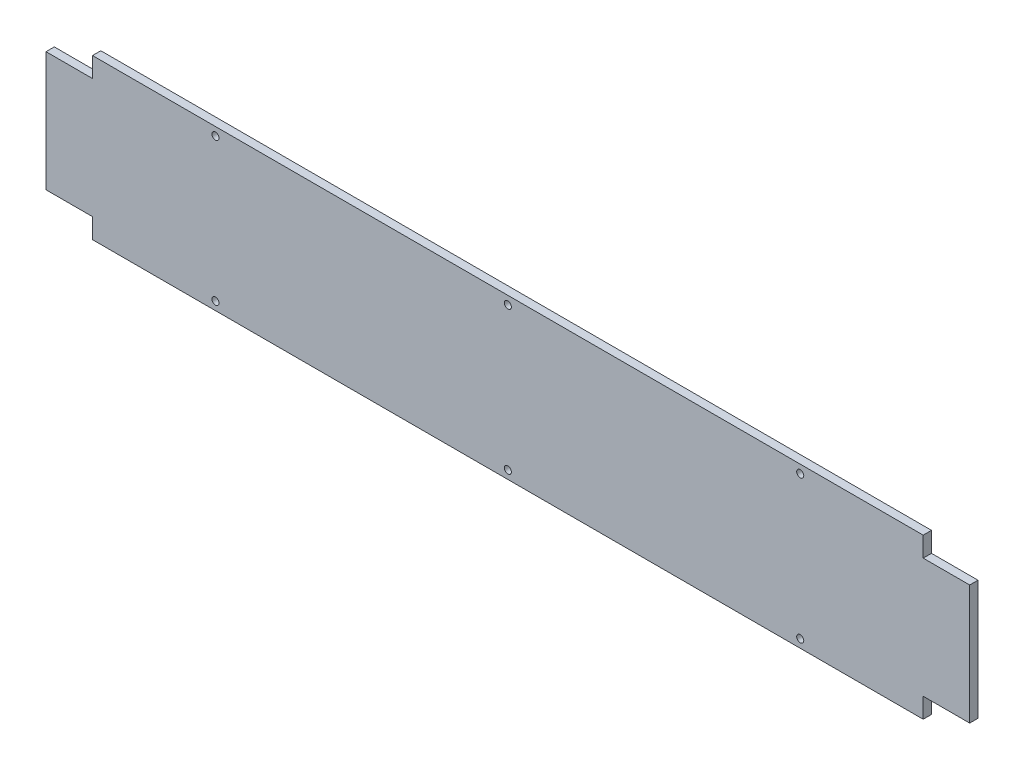
ISO-10303-21;
HEADER;
FILE_DESCRIPTION(('STEP AP214'),'2;1');
FILE_NAME('part.step','',(''),(''),'','','');
FILE_SCHEMA(('AUTOMOTIVE_DESIGN { 1 0 10303 214 1 1 1 1 }'));
ENDSEC;
DATA;
#1=APPLICATION_CONTEXT('core data for automotive mechanical design processes');
#2=APPLICATION_PROTOCOL_DEFINITION('international standard','automotive_design',2000,#1);
#3=PRODUCT_CONTEXT('',#1,'mechanical');
#4=PRODUCT('Part','Part','',(#3));
#5=PRODUCT_RELATED_PRODUCT_CATEGORY('part','',(#4));
#6=PRODUCT_DEFINITION_FORMATION('','',#4);
#7=PRODUCT_DEFINITION_CONTEXT('part definition',#1,'design');
#8=PRODUCT_DEFINITION('design','',#6,#7);
#9=PRODUCT_DEFINITION_SHAPE('','',#8);
#10=(LENGTH_UNIT() NAMED_UNIT(*) SI_UNIT(.MILLI.,.METRE.));
#11=(NAMED_UNIT(*) PLANE_ANGLE_UNIT() SI_UNIT($,.RADIAN.));
#12=(NAMED_UNIT(*) SI_UNIT($,.STERADIAN.) SOLID_ANGLE_UNIT());
#13=UNCERTAINTY_MEASURE_WITH_UNIT(LENGTH_MEASURE(1.E-05),#10,'distance_accuracy_value','');
#14=(GEOMETRIC_REPRESENTATION_CONTEXT(3) GLOBAL_UNCERTAINTY_ASSIGNED_CONTEXT((#13)) GLOBAL_UNIT_ASSIGNED_CONTEXT((#10,
#11,#12)) REPRESENTATION_CONTEXT('',''));
#15=CARTESIAN_POINT('',(0.,0.,0.));
#16=DIRECTION('',(0.,0.,1.));
#17=DIRECTION('',(1.,0.,0.));
#18=AXIS2_PLACEMENT_3D('',#15,#16,#17);
#19=CARTESIAN_POINT('',(0.,0.,5.));
#20=DIRECTION('',(1.,0.,0.));
#21=DIRECTION('',(0.,0.,-1.));
#22=AXIS2_PLACEMENT_3D('',#19,#20,#21);
#23=PLANE('',#22);
#24=DIRECTION('',(0.,0.,1.));
#25=VECTOR('',#24,1.);
#26=CARTESIAN_POINT('',(0.,12.,0.));
#27=LINE('',#26,#25);
#28=CARTESIAN_POINT('',(0.,12.,0.));
#29=VERTEX_POINT('',#28);
#30=CARTESIAN_POINT('',(0.,12.,5.));
#31=VERTEX_POINT('',#30);
#32=EDGE_CURVE('E132',#29,#31,#27,.T.);
#33=ORIENTED_EDGE('',*,*,#32,.F.);
#34=DIRECTION('',(0.,-1.,0.));
#35=VECTOR('',#34,1.);
#36=CARTESIAN_POINT('',(0.,0.,0.));
#37=LINE('',#36,#35);
#38=CARTESIAN_POINT('',(0.,0.,0.));
#39=VERTEX_POINT('',#38);
#40=EDGE_CURVE('E176',#29,#39,#37,.T.);
#41=ORIENTED_EDGE('',*,*,#40,.T.);
#42=DIRECTION('',(0.,0.,-1.));
#43=VECTOR('',#42,1.);
#44=CARTESIAN_POINT('',(0.,0.,5.));
#45=LINE('',#44,#43);
#46=CARTESIAN_POINT('',(0.,0.,5.));
#47=VERTEX_POINT('',#46);
#48=EDGE_CURVE('E11',#47,#39,#45,.T.);
#49=ORIENTED_EDGE('',*,*,#48,.F.);
#50=DIRECTION('',(0.,-1.,0.));
#51=VECTOR('',#50,1.);
#52=CARTESIAN_POINT('',(0.,0.,5.));
#53=LINE('',#52,#51);
#54=EDGE_CURVE('E147',#31,#47,#53,.T.);
#55=ORIENTED_EDGE('',*,*,#54,.F.);
#56=EDGE_LOOP('',(#33,#41,#49,#55));
#57=FACE_BOUND('',#56,.T.);
#58=ADVANCED_FACE('F43',(#57),#23,.F.);
#59=CARTESIAN_POINT('',(500.,0.,5.));
#60=DIRECTION('',(-1.,0.,0.));
#61=DIRECTION('',(0.,0.,1.));
#62=AXIS2_PLACEMENT_3D('',#59,#60,#61);
#63=PLANE('',#62);
#64=DIRECTION('',(0.,0.,1.));
#65=VECTOR('',#64,1.);
#66=CARTESIAN_POINT('',(500.,84.,0.));
#67=LINE('',#66,#65);
#68=CARTESIAN_POINT('',(500.,84.,0.));
#69=VERTEX_POINT('',#68);
#70=CARTESIAN_POINT('',(500.,84.,5.));
#71=VERTEX_POINT('',#70);
#72=EDGE_CURVE('E218',#69,#71,#67,.T.);
#73=ORIENTED_EDGE('',*,*,#72,.F.);
#74=DIRECTION('',(0.,1.,0.));
#75=VECTOR('',#74,1.);
#76=CARTESIAN_POINT('',(500.,0.,0.));
#77=LINE('',#76,#75);
#78=CARTESIAN_POINT('',(500.,96.,0.));
#79=VERTEX_POINT('',#78);
#80=EDGE_CURVE('E178',#69,#79,#77,.T.);
#81=ORIENTED_EDGE('',*,*,#80,.T.);
#82=DIRECTION('',(0.,0.,-1.));
#83=VECTOR('',#82,1.);
#84=CARTESIAN_POINT('',(500.,96.,5.));
#85=LINE('',#84,#83);
#86=CARTESIAN_POINT('',(500.,96.,5.));
#87=VERTEX_POINT('',#86);
#88=EDGE_CURVE('E183',#87,#79,#85,.T.);
#89=ORIENTED_EDGE('',*,*,#88,.F.);
#90=DIRECTION('',(0.,1.,0.));
#91=VECTOR('',#90,1.);
#92=CARTESIAN_POINT('',(500.,0.,5.));
#93=LINE('',#92,#91);
#94=EDGE_CURVE('E165',#71,#87,#93,.T.);
#95=ORIENTED_EDGE('',*,*,#94,.F.);
#96=EDGE_LOOP('',(#73,#81,#89,#95));
#97=FACE_BOUND('',#96,.T.);
#98=ADVANCED_FACE('F280',(#97),#63,.F.);
#99=CARTESIAN_POINT('',(0.,96.,0.));
#100=VERTEX_POINT('',#99);
#101=CARTESIAN_POINT('',(0.,84.,0.));
#102=VERTEX_POINT('',#101);
#103=EDGE_CURVE('E172',#100,#102,#37,.T.);
#104=ORIENTED_EDGE('',*,*,#103,.T.);
#105=DIRECTION('',(0.,0.,1.));
#106=VECTOR('',#105,1.);
#107=CARTESIAN_POINT('',(0.,84.,0.));
#108=LINE('',#107,#106);
#109=CARTESIAN_POINT('',(0.,84.,5.));
#110=VERTEX_POINT('',#109);
#111=EDGE_CURVE('E294',#102,#110,#108,.T.);
#112=ORIENTED_EDGE('',*,*,#111,.T.);
#113=CARTESIAN_POINT('',(0.,96.,5.));
#114=VERTEX_POINT('',#113);
#115=EDGE_CURVE('E154',#114,#110,#53,.T.);
#116=ORIENTED_EDGE('',*,*,#115,.F.);
#117=DIRECTION('',(0.,0.,-1.));
#118=VECTOR('',#117,1.);
#119=CARTESIAN_POINT('',(0.,96.,5.));
#120=LINE('',#119,#118);
#121=EDGE_CURVE('E171',#114,#100,#120,.T.);
#122=ORIENTED_EDGE('',*,*,#121,.T.);
#123=EDGE_LOOP('',(#104,#112,#116,#122));
#124=FACE_BOUND('',#123,.T.);
#125=ADVANCED_FACE('F45',(#124),#23,.F.);
#126=CARTESIAN_POINT('',(0.,0.,5.));
#127=DIRECTION('',(0.,1.,0.));
#128=DIRECTION('',(0.,0.,1.));
#129=AXIS2_PLACEMENT_3D('',#126,#127,#128);
#130=PLANE('',#129);
#131=DIRECTION('',(1.,0.,0.));
#132=VECTOR('',#131,1.);
#133=CARTESIAN_POINT('',(0.,0.,0.));
#134=LINE('',#133,#132);
#135=CARTESIAN_POINT('',(500.,0.,0.));
#136=VERTEX_POINT('',#135);
#137=EDGE_CURVE('E175',#39,#136,#134,.T.);
#138=ORIENTED_EDGE('',*,*,#137,.T.);
#139=DIRECTION('',(0.,0.,-1.));
#140=VECTOR('',#139,1.);
#141=CARTESIAN_POINT('',(500.,0.,5.));
#142=LINE('',#141,#140);
#143=CARTESIAN_POINT('',(500.,0.,5.));
#144=VERTEX_POINT('',#143);
#145=EDGE_CURVE('E51',#144,#136,#142,.T.);
#146=ORIENTED_EDGE('',*,*,#145,.F.);
#147=DIRECTION('',(1.,0.,0.));
#148=VECTOR('',#147,1.);
#149=CARTESIAN_POINT('',(0.,0.,5.));
#150=LINE('',#149,#148);
#151=EDGE_CURVE('E157',#47,#144,#150,.T.);
#152=ORIENTED_EDGE('',*,*,#151,.F.);
#153=ORIENTED_EDGE('',*,*,#48,.T.);
#154=EDGE_LOOP('',(#138,#146,#152,#153));
#155=FACE_BOUND('',#154,.T.);
#156=ADVANCED_FACE('F288',(#155),#130,.F.);
#157=CARTESIAN_POINT('',(500.,12.,0.));
#158=VERTEX_POINT('',#157);
#159=EDGE_CURVE('E158',#136,#158,#77,.T.);
#160=ORIENTED_EDGE('',*,*,#159,.T.);
#161=DIRECTION('',(0.,0.,1.));
#162=VECTOR('',#161,1.);
#163=CARTESIAN_POINT('',(500.,12.,0.));
#164=LINE('',#163,#162);
#165=CARTESIAN_POINT('',(500.,12.,5.));
#166=VERTEX_POINT('',#165);
#167=EDGE_CURVE('E214',#158,#166,#164,.T.);
#168=ORIENTED_EDGE('',*,*,#167,.T.);
#169=EDGE_CURVE('E166',#144,#166,#93,.T.);
#170=ORIENTED_EDGE('',*,*,#169,.F.);
#171=ORIENTED_EDGE('',*,*,#145,.T.);
#172=EDGE_LOOP('',(#160,#168,#170,#171));
#173=FACE_BOUND('',#172,.T.);
#174=ADVANCED_FACE('F190',(#173),#63,.F.);
#175=CARTESIAN_POINT('',(0.,96.,5.));
#176=DIRECTION('',(0.,-1.,0.));
#177=DIRECTION('',(0.,0.,-1.));
#178=AXIS2_PLACEMENT_3D('',#175,#176,#177);
#179=PLANE('',#178);
#180=DIRECTION('',(-1.,0.,0.));
#181=VECTOR('',#180,1.);
#182=CARTESIAN_POINT('',(0.,96.,0.));
#183=LINE('',#182,#181);
#184=EDGE_CURVE('E155',#79,#100,#183,.T.);
#185=ORIENTED_EDGE('',*,*,#184,.T.);
#186=ORIENTED_EDGE('',*,*,#121,.F.);
#187=DIRECTION('',(-1.,0.,0.));
#188=VECTOR('',#187,1.);
#189=CARTESIAN_POINT('',(0.,96.,5.));
#190=LINE('',#189,#188);
#191=EDGE_CURVE('E169',#87,#114,#190,.T.);
#192=ORIENTED_EDGE('',*,*,#191,.F.);
#193=ORIENTED_EDGE('',*,*,#88,.T.);
#194=EDGE_LOOP('',(#185,#186,#192,#193));
#195=FACE_BOUND('',#194,.T.);
#196=ADVANCED_FACE('F264',(#195),#179,.F.);
#197=CARTESIAN_POINT('',(0.,0.,5.));
#198=DIRECTION('',(0.,0.,-1.));
#199=DIRECTION('',(-1.,0.,0.));
#200=AXIS2_PLACEMENT_3D('',#197,#198,#199);
#201=PLANE('',#200);
#202=CARTESIAN_POINT('',(74.,5.,5.));
#203=DIRECTION('',(0.,0.,1.));
#204=DIRECTION('',(-1.,0.,0.));
#205=AXIS2_PLACEMENT_3D('',#202,#203,#204);
#206=CIRCLE('',#205,2.125);
#207=CARTESIAN_POINT('',(71.875,5.,5.));
#208=VERTEX_POINT('',#207);
#209=EDGE_CURVE('E250',#208,#208,#206,.T.);
#210=ORIENTED_EDGE('',*,*,#209,.F.);
#211=EDGE_LOOP('',(#210));
#212=FACE_BOUND('',#211,.T.);
#213=CARTESIAN_POINT('',(250.,5.,5.));
#214=DIRECTION('',(0.,0.,1.));
#215=DIRECTION('',(-1.,0.,0.));
#216=AXIS2_PLACEMENT_3D('',#213,#214,#215);
#217=CIRCLE('',#216,2.125);
#218=CARTESIAN_POINT('',(247.875,5.,5.));
#219=VERTEX_POINT('',#218);
#220=EDGE_CURVE('E244',#219,#219,#217,.T.);
#221=ORIENTED_EDGE('',*,*,#220,.F.);
#222=EDGE_LOOP('',(#221));
#223=FACE_BOUND('',#222,.T.);
#224=CARTESIAN_POINT('',(426.,5.,5.));
#225=DIRECTION('',(0.,0.,1.));
#226=DIRECTION('',(-1.,0.,0.));
#227=AXIS2_PLACEMENT_3D('',#224,#225,#226);
#228=CIRCLE('',#227,2.125);
#229=CARTESIAN_POINT('',(423.875,5.,5.));
#230=VERTEX_POINT('',#229);
#231=EDGE_CURVE('E238',#230,#230,#228,.T.);
#232=ORIENTED_EDGE('',*,*,#231,.F.);
#233=EDGE_LOOP('',(#232));
#234=FACE_BOUND('',#233,.T.);
#235=CARTESIAN_POINT('',(426.,91.,5.));
#236=DIRECTION('',(0.,0.,1.));
#237=DIRECTION('',(1.,0.,0.));
#238=AXIS2_PLACEMENT_3D('',#235,#236,#237);
#239=CIRCLE('',#238,2.125);
#240=CARTESIAN_POINT('',(428.125,91.,5.));
#241=VERTEX_POINT('',#240);
#242=EDGE_CURVE('E232',#241,#241,#239,.T.);
#243=ORIENTED_EDGE('',*,*,#242,.F.);
#244=EDGE_LOOP('',(#243));
#245=FACE_BOUND('',#244,.T.);
#246=CARTESIAN_POINT('',(250.,91.,5.));
#247=DIRECTION('',(0.,0.,1.));
#248=DIRECTION('',(1.,0.,0.));
#249=AXIS2_PLACEMENT_3D('',#246,#247,#248);
#250=CIRCLE('',#249,2.125);
#251=CARTESIAN_POINT('',(252.125,91.,5.));
#252=VERTEX_POINT('',#251);
#253=EDGE_CURVE('E226',#252,#252,#250,.T.);
#254=ORIENTED_EDGE('',*,*,#253,.F.);
#255=EDGE_LOOP('',(#254));
#256=FACE_BOUND('',#255,.T.);
#257=CARTESIAN_POINT('',(74.,91.,5.));
#258=DIRECTION('',(0.,0.,1.));
#259=DIRECTION('',(1.,0.,0.));
#260=AXIS2_PLACEMENT_3D('',#257,#258,#259);
#261=CIRCLE('',#260,2.125);
#262=CARTESIAN_POINT('',(76.125,91.,5.));
#263=VERTEX_POINT('',#262);
#264=EDGE_CURVE('E162',#263,#263,#261,.T.);
#265=ORIENTED_EDGE('',*,*,#264,.F.);
#266=EDGE_LOOP('',(#265));
#267=FACE_BOUND('',#266,.T.);
#268=ORIENTED_EDGE('',*,*,#115,.T.);
#269=DIRECTION('',(-1.,0.,0.));
#270=VECTOR('',#269,1.);
#271=CARTESIAN_POINT('',(0.,84.,5.));
#272=LINE('',#271,#270);
#273=CARTESIAN_POINT('',(-28.,84.,5.));
#274=VERTEX_POINT('',#273);
#275=EDGE_CURVE('E58',#110,#274,#272,.T.);
#276=ORIENTED_EDGE('',*,*,#275,.T.);
#277=DIRECTION('',(0.,-1.,0.));
#278=VECTOR('',#277,1.);
#279=CARTESIAN_POINT('',(-28.,84.,5.));
#280=LINE('',#279,#278);
#281=CARTESIAN_POINT('',(-28.,12.,5.));
#282=VERTEX_POINT('',#281);
#283=EDGE_CURVE('E150',#274,#282,#280,.T.);
#284=ORIENTED_EDGE('',*,*,#283,.T.);
#285=DIRECTION('',(1.,0.,0.));
#286=VECTOR('',#285,1.);
#287=CARTESIAN_POINT('',(0.,12.,5.));
#288=LINE('',#287,#286);
#289=EDGE_CURVE('E135',#282,#31,#288,.T.);
#290=ORIENTED_EDGE('',*,*,#289,.T.);
#291=ORIENTED_EDGE('',*,*,#54,.T.);
#292=ORIENTED_EDGE('',*,*,#151,.T.);
#293=ORIENTED_EDGE('',*,*,#169,.T.);
#294=DIRECTION('',(1.,0.,0.));
#295=VECTOR('',#294,1.);
#296=CARTESIAN_POINT('',(500.,12.,5.));
#297=LINE('',#296,#295);
#298=CARTESIAN_POINT('',(528.,12.,5.));
#299=VERTEX_POINT('',#298);
#300=EDGE_CURVE('E66',#166,#299,#297,.T.);
#301=ORIENTED_EDGE('',*,*,#300,.T.);
#302=DIRECTION('',(0.,1.,0.));
#303=VECTOR('',#302,1.);
#304=CARTESIAN_POINT('',(528.,84.,5.));
#305=LINE('',#304,#303);
#306=CARTESIAN_POINT('',(528.,84.,5.));
#307=VERTEX_POINT('',#306);
#308=EDGE_CURVE('E208',#299,#307,#305,.T.);
#309=ORIENTED_EDGE('',*,*,#308,.T.);
#310=DIRECTION('',(-1.,0.,0.));
#311=VECTOR('',#310,1.);
#312=CARTESIAN_POINT('',(500.,84.,5.));
#313=LINE('',#312,#311);
#314=EDGE_CURVE('E203',#307,#71,#313,.T.);
#315=ORIENTED_EDGE('',*,*,#314,.T.);
#316=ORIENTED_EDGE('',*,*,#94,.T.);
#317=ORIENTED_EDGE('',*,*,#191,.T.);
#318=EDGE_LOOP('',(#268,#276,#284,#290,#291,#292,#293,#301,#309,#315,#316,#317));
#319=FACE_BOUND('',#318,.T.);
#320=ADVANCED_FACE('F146',(#212,#223,#234,#245,#256,#267,#319),#201,.F.);
#321=CARTESIAN_POINT('',(0.,0.,0.));
#322=DIRECTION('',(0.,0.,-1.));
#323=DIRECTION('',(-1.,0.,0.));
#324=AXIS2_PLACEMENT_3D('',#321,#322,#323);
#325=PLANE('',#324);
#326=CARTESIAN_POINT('',(74.,5.,0.));
#327=DIRECTION('',(0.,0.,1.));
#328=DIRECTION('',(-1.,0.,0.));
#329=AXIS2_PLACEMENT_3D('',#326,#327,#328);
#330=CIRCLE('',#329,2.125);
#331=CARTESIAN_POINT('',(71.875,5.,0.));
#332=VERTEX_POINT('',#331);
#333=EDGE_CURVE('E220',#332,#332,#330,.T.);
#334=ORIENTED_EDGE('',*,*,#333,.T.);
#335=EDGE_LOOP('',(#334));
#336=FACE_BOUND('',#335,.T.);
#337=CARTESIAN_POINT('',(250.,5.,0.));
#338=DIRECTION('',(0.,0.,1.));
#339=DIRECTION('',(-1.,0.,0.));
#340=AXIS2_PLACEMENT_3D('',#337,#338,#339);
#341=CIRCLE('',#340,2.125);
#342=CARTESIAN_POINT('',(247.875,5.,0.));
#343=VERTEX_POINT('',#342);
#344=EDGE_CURVE('E247',#343,#343,#341,.T.);
#345=ORIENTED_EDGE('',*,*,#344,.T.);
#346=EDGE_LOOP('',(#345));
#347=FACE_BOUND('',#346,.T.);
#348=CARTESIAN_POINT('',(426.,5.,0.));
#349=DIRECTION('',(0.,0.,1.));
#350=DIRECTION('',(-1.,0.,0.));
#351=AXIS2_PLACEMENT_3D('',#348,#349,#350);
#352=CIRCLE('',#351,2.125);
#353=CARTESIAN_POINT('',(423.875,5.,0.));
#354=VERTEX_POINT('',#353);
#355=EDGE_CURVE('E241',#354,#354,#352,.T.);
#356=ORIENTED_EDGE('',*,*,#355,.T.);
#357=EDGE_LOOP('',(#356));
#358=FACE_BOUND('',#357,.T.);
#359=CARTESIAN_POINT('',(426.,91.,0.));
#360=DIRECTION('',(0.,0.,1.));
#361=DIRECTION('',(1.,0.,0.));
#362=AXIS2_PLACEMENT_3D('',#359,#360,#361);
#363=CIRCLE('',#362,2.125);
#364=CARTESIAN_POINT('',(428.125,91.,0.));
#365=VERTEX_POINT('',#364);
#366=EDGE_CURVE('E235',#365,#365,#363,.T.);
#367=ORIENTED_EDGE('',*,*,#366,.T.);
#368=EDGE_LOOP('',(#367));
#369=FACE_BOUND('',#368,.T.);
#370=CARTESIAN_POINT('',(250.,91.,0.));
#371=DIRECTION('',(0.,0.,1.));
#372=DIRECTION('',(1.,0.,0.));
#373=AXIS2_PLACEMENT_3D('',#370,#371,#372);
#374=CIRCLE('',#373,2.125);
#375=CARTESIAN_POINT('',(252.125,91.,0.));
#376=VERTEX_POINT('',#375);
#377=EDGE_CURVE('E229',#376,#376,#374,.T.);
#378=ORIENTED_EDGE('',*,*,#377,.T.);
#379=EDGE_LOOP('',(#378));
#380=FACE_BOUND('',#379,.T.);
#381=CARTESIAN_POINT('',(74.,91.,0.));
#382=DIRECTION('',(0.,0.,1.));
#383=DIRECTION('',(1.,0.,0.));
#384=AXIS2_PLACEMENT_3D('',#381,#382,#383);
#385=CIRCLE('',#384,2.125);
#386=CARTESIAN_POINT('',(76.125,91.,0.));
#387=VERTEX_POINT('',#386);
#388=EDGE_CURVE('E254',#387,#387,#385,.T.);
#389=ORIENTED_EDGE('',*,*,#388,.T.);
#390=EDGE_LOOP('',(#389));
#391=FACE_BOUND('',#390,.T.);
#392=ORIENTED_EDGE('',*,*,#103,.F.);
#393=ORIENTED_EDGE('',*,*,#184,.F.);
#394=ORIENTED_EDGE('',*,*,#80,.F.);
#395=DIRECTION('',(-1.,0.,0.));
#396=VECTOR('',#395,1.);
#397=CARTESIAN_POINT('',(500.,84.,0.));
#398=LINE('',#397,#396);
#399=CARTESIAN_POINT('',(528.,84.,0.));
#400=VERTEX_POINT('',#399);
#401=EDGE_CURVE('E205',#400,#69,#398,.T.);
#402=ORIENTED_EDGE('',*,*,#401,.F.);
#403=DIRECTION('',(0.,1.,0.));
#404=VECTOR('',#403,1.);
#405=CARTESIAN_POINT('',(528.,84.,0.));
#406=LINE('',#405,#404);
#407=CARTESIAN_POINT('',(528.,12.,0.));
#408=VERTEX_POINT('',#407);
#409=EDGE_CURVE('E202',#408,#400,#406,.T.);
#410=ORIENTED_EDGE('',*,*,#409,.F.);
#411=DIRECTION('',(1.,0.,0.));
#412=VECTOR('',#411,1.);
#413=CARTESIAN_POINT('',(500.,12.,0.));
#414=LINE('',#413,#412);
#415=EDGE_CURVE('E199',#158,#408,#414,.T.);
#416=ORIENTED_EDGE('',*,*,#415,.F.);
#417=ORIENTED_EDGE('',*,*,#159,.F.);
#418=ORIENTED_EDGE('',*,*,#137,.F.);
#419=ORIENTED_EDGE('',*,*,#40,.F.);
#420=DIRECTION('',(1.,0.,0.));
#421=VECTOR('',#420,1.);
#422=CARTESIAN_POINT('',(0.,12.,0.));
#423=LINE('',#422,#421);
#424=CARTESIAN_POINT('',(-28.,12.,0.));
#425=VERTEX_POINT('',#424);
#426=EDGE_CURVE('E137',#425,#29,#423,.T.);
#427=ORIENTED_EDGE('',*,*,#426,.F.);
#428=DIRECTION('',(0.,-1.,0.));
#429=VECTOR('',#428,1.);
#430=CARTESIAN_POINT('',(-28.,84.,0.));
#431=LINE('',#430,#429);
#432=CARTESIAN_POINT('',(-28.,84.,0.));
#433=VERTEX_POINT('',#432);
#434=EDGE_CURVE('E302',#433,#425,#431,.T.);
#435=ORIENTED_EDGE('',*,*,#434,.F.);
#436=DIRECTION('',(-1.,0.,0.));
#437=VECTOR('',#436,1.);
#438=CARTESIAN_POINT('',(0.,84.,0.));
#439=LINE('',#438,#437);
#440=EDGE_CURVE('E151',#102,#433,#439,.T.);
#441=ORIENTED_EDGE('',*,*,#440,.F.);
#442=EDGE_LOOP('',(#392,#393,#394,#402,#410,#416,#417,#418,#419,#427,#435,#441));
#443=FACE_BOUND('',#442,.T.);
#444=ADVANCED_FACE('F196',(#336,#347,#358,#369,#380,#391,#443),#325,.T.);
#445=CARTESIAN_POINT('',(74.,91.,0.));
#446=DIRECTION('',(0.,0.,1.));
#447=DIRECTION('',(1.,0.,0.));
#448=AXIS2_PLACEMENT_3D('',#445,#446,#447);
#449=CYLINDRICAL_SURFACE('',#448,2.125);
#450=ORIENTED_EDGE('',*,*,#388,.F.);
#451=EDGE_LOOP('',(#450));
#452=FACE_BOUND('',#451,.T.);
#453=ORIENTED_EDGE('',*,*,#264,.T.);
#454=EDGE_LOOP('',(#453));
#455=FACE_BOUND('',#454,.T.);
#456=ADVANCED_FACE('F261',(#452,#455),#449,.F.);
#457=CARTESIAN_POINT('',(250.,91.,0.));
#458=DIRECTION('',(0.,0.,1.));
#459=DIRECTION('',(1.,0.,0.));
#460=AXIS2_PLACEMENT_3D('',#457,#458,#459);
#461=CYLINDRICAL_SURFACE('',#460,2.125);
#462=ORIENTED_EDGE('',*,*,#377,.F.);
#463=EDGE_LOOP('',(#462));
#464=FACE_BOUND('',#463,.T.);
#465=ORIENTED_EDGE('',*,*,#253,.T.);
#466=EDGE_LOOP('',(#465));
#467=FACE_BOUND('',#466,.T.);
#468=ADVANCED_FACE('F334',(#464,#467),#461,.F.);
#469=CARTESIAN_POINT('',(426.,91.,0.));
#470=DIRECTION('',(0.,0.,1.));
#471=DIRECTION('',(1.,0.,0.));
#472=AXIS2_PLACEMENT_3D('',#469,#470,#471);
#473=CYLINDRICAL_SURFACE('',#472,2.125);
#474=ORIENTED_EDGE('',*,*,#366,.F.);
#475=EDGE_LOOP('',(#474));
#476=FACE_BOUND('',#475,.T.);
#477=ORIENTED_EDGE('',*,*,#242,.T.);
#478=EDGE_LOOP('',(#477));
#479=FACE_BOUND('',#478,.T.);
#480=ADVANCED_FACE('F337',(#476,#479),#473,.F.);
#481=CARTESIAN_POINT('',(426.,5.,0.));
#482=DIRECTION('',(0.,0.,1.));
#483=DIRECTION('',(1.,0.,0.));
#484=AXIS2_PLACEMENT_3D('',#481,#482,#483);
#485=CYLINDRICAL_SURFACE('',#484,2.125);
#486=ORIENTED_EDGE('',*,*,#355,.F.);
#487=EDGE_LOOP('',(#486));
#488=FACE_BOUND('',#487,.T.);
#489=ORIENTED_EDGE('',*,*,#231,.T.);
#490=EDGE_LOOP('',(#489));
#491=FACE_BOUND('',#490,.T.);
#492=ADVANCED_FACE('F341',(#488,#491),#485,.F.);
#493=CARTESIAN_POINT('',(250.,5.,0.));
#494=DIRECTION('',(0.,0.,1.));
#495=DIRECTION('',(1.,0.,0.));
#496=AXIS2_PLACEMENT_3D('',#493,#494,#495);
#497=CYLINDRICAL_SURFACE('',#496,2.125);
#498=ORIENTED_EDGE('',*,*,#344,.F.);
#499=EDGE_LOOP('',(#498));
#500=FACE_BOUND('',#499,.T.);
#501=ORIENTED_EDGE('',*,*,#220,.T.);
#502=EDGE_LOOP('',(#501));
#503=FACE_BOUND('',#502,.T.);
#504=ADVANCED_FACE('F345',(#500,#503),#497,.F.);
#505=CARTESIAN_POINT('',(74.,5.,0.));
#506=DIRECTION('',(0.,0.,1.));
#507=DIRECTION('',(1.,0.,0.));
#508=AXIS2_PLACEMENT_3D('',#505,#506,#507);
#509=CYLINDRICAL_SURFACE('',#508,2.125);
#510=ORIENTED_EDGE('',*,*,#333,.F.);
#511=EDGE_LOOP('',(#510));
#512=FACE_BOUND('',#511,.T.);
#513=ORIENTED_EDGE('',*,*,#209,.T.);
#514=EDGE_LOOP('',(#513));
#515=FACE_BOUND('',#514,.T.);
#516=ADVANCED_FACE('F349',(#512,#515),#509,.F.);
#517=CARTESIAN_POINT('',(500.,84.,0.));
#518=DIRECTION('',(0.,1.,0.));
#519=DIRECTION('',(0.,0.,1.));
#520=AXIS2_PLACEMENT_3D('',#517,#518,#519);
#521=PLANE('',#520);
#522=ORIENTED_EDGE('',*,*,#314,.F.);
#523=DIRECTION('',(0.,0.,1.));
#524=VECTOR('',#523,1.);
#525=CARTESIAN_POINT('',(528.,84.,0.));
#526=LINE('',#525,#524);
#527=EDGE_CURVE('E221',#400,#307,#526,.T.);
#528=ORIENTED_EDGE('',*,*,#527,.F.);
#529=ORIENTED_EDGE('',*,*,#401,.T.);
#530=ORIENTED_EDGE('',*,*,#72,.T.);
#531=EDGE_LOOP('',(#522,#528,#529,#530));
#532=FACE_BOUND('',#531,.T.);
#533=ADVANCED_FACE('F319',(#532),#521,.T.);
#534=CARTESIAN_POINT('',(528.,84.,0.));
#535=DIRECTION('',(1.,0.,0.));
#536=DIRECTION('',(0.,0.,-1.));
#537=AXIS2_PLACEMENT_3D('',#534,#535,#536);
#538=PLANE('',#537);
#539=ORIENTED_EDGE('',*,*,#308,.F.);
#540=DIRECTION('',(0.,0.,1.));
#541=VECTOR('',#540,1.);
#542=CARTESIAN_POINT('',(528.,12.,0.));
#543=LINE('',#542,#541);
#544=EDGE_CURVE('E223',#408,#299,#543,.T.);
#545=ORIENTED_EDGE('',*,*,#544,.F.);
#546=ORIENTED_EDGE('',*,*,#409,.T.);
#547=ORIENTED_EDGE('',*,*,#527,.T.);
#548=EDGE_LOOP('',(#539,#545,#546,#547));
#549=FACE_BOUND('',#548,.T.);
#550=ADVANCED_FACE('F322',(#549),#538,.T.);
#551=CARTESIAN_POINT('',(500.,12.,0.));
#552=DIRECTION('',(0.,-1.,0.));
#553=DIRECTION('',(0.,0.,-1.));
#554=AXIS2_PLACEMENT_3D('',#551,#552,#553);
#555=PLANE('',#554);
#556=ORIENTED_EDGE('',*,*,#300,.F.);
#557=ORIENTED_EDGE('',*,*,#167,.F.);
#558=ORIENTED_EDGE('',*,*,#415,.T.);
#559=ORIENTED_EDGE('',*,*,#544,.T.);
#560=EDGE_LOOP('',(#556,#557,#558,#559));
#561=FACE_BOUND('',#560,.T.);
#562=ADVANCED_FACE('F323',(#561),#555,.T.);
#563=CARTESIAN_POINT('',(0.,12.,0.));
#564=DIRECTION('',(0.,-1.,0.));
#565=DIRECTION('',(1.,0.,0.));
#566=AXIS2_PLACEMENT_3D('',#563,#564,#565);
#567=PLANE('',#566);
#568=ORIENTED_EDGE('',*,*,#289,.F.);
#569=DIRECTION('',(0.,0.,1.));
#570=VECTOR('',#569,1.);
#571=CARTESIAN_POINT('',(-28.,12.,0.));
#572=LINE('',#571,#570);
#573=EDGE_CURVE('E141',#425,#282,#572,.T.);
#574=ORIENTED_EDGE('',*,*,#573,.F.);
#575=ORIENTED_EDGE('',*,*,#426,.T.);
#576=ORIENTED_EDGE('',*,*,#32,.T.);
#577=EDGE_LOOP('',(#568,#574,#575,#576));
#578=FACE_BOUND('',#577,.T.);
#579=ADVANCED_FACE('F134',(#578),#567,.T.);
#580=CARTESIAN_POINT('',(-28.,84.,0.));
#581=DIRECTION('',(-1.,0.,0.));
#582=DIRECTION('',(0.,-1.,0.));
#583=AXIS2_PLACEMENT_3D('',#580,#581,#582);
#584=PLANE('',#583);
#585=ORIENTED_EDGE('',*,*,#283,.F.);
#586=DIRECTION('',(0.,0.,1.));
#587=VECTOR('',#586,1.);
#588=CARTESIAN_POINT('',(-28.,84.,0.));
#589=LINE('',#588,#587);
#590=EDGE_CURVE('E309',#433,#274,#589,.T.);
#591=ORIENTED_EDGE('',*,*,#590,.F.);
#592=ORIENTED_EDGE('',*,*,#434,.T.);
#593=ORIENTED_EDGE('',*,*,#573,.T.);
#594=EDGE_LOOP('',(#585,#591,#592,#593));
#595=FACE_BOUND('',#594,.T.);
#596=ADVANCED_FACE('F312',(#595),#584,.T.);
#597=CARTESIAN_POINT('',(0.,84.,0.));
#598=DIRECTION('',(0.,1.,0.));
#599=DIRECTION('',(0.,0.,1.));
#600=AXIS2_PLACEMENT_3D('',#597,#598,#599);
#601=PLANE('',#600);
#602=ORIENTED_EDGE('',*,*,#275,.F.);
#603=ORIENTED_EDGE('',*,*,#111,.F.);
#604=ORIENTED_EDGE('',*,*,#440,.T.);
#605=ORIENTED_EDGE('',*,*,#590,.T.);
#606=EDGE_LOOP('',(#602,#603,#604,#605));
#607=FACE_BOUND('',#606,.T.);
#608=ADVANCED_FACE('F311',(#607),#601,.T.);
#609=CLOSED_SHELL('',(#58,#98,#125,#156,#174,#196,#320,#444,#456,#468,#480,#492,#504,#516,#533,
#550,#562,#579,#596,#608));
#610=MANIFOLD_SOLID_BREP('B2',#609);
#611=ADVANCED_BREP_SHAPE_REPRESENTATION('',(#18,#610),#14);
#612=SHAPE_DEFINITION_REPRESENTATION(#9,#611);
ENDSEC;
END-ISO-10303-21;
